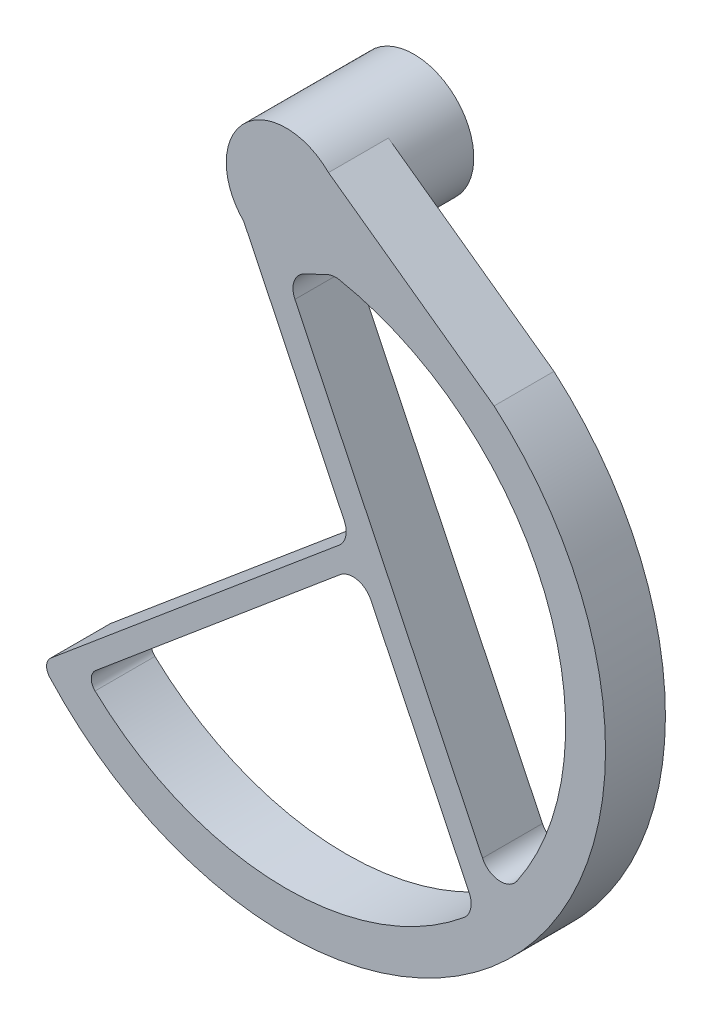
ISO-10303-21;
HEADER;
FILE_DESCRIPTION(('STEP AP214'),'2;1');
FILE_NAME('part.step','',(''),(''),'','','');
FILE_SCHEMA(('AUTOMOTIVE_DESIGN { 1 0 10303 214 1 1 1 1 }'));
ENDSEC;
DATA;
#1=APPLICATION_CONTEXT('core data for automotive mechanical design processes');
#2=APPLICATION_PROTOCOL_DEFINITION('international standard','automotive_design',2000,#1);
#3=PRODUCT_CONTEXT('',#1,'mechanical');
#4=PRODUCT('Part','Part','',(#3));
#5=PRODUCT_RELATED_PRODUCT_CATEGORY('part','',(#4));
#6=PRODUCT_DEFINITION_FORMATION('','',#4);
#7=PRODUCT_DEFINITION_CONTEXT('part definition',#1,'design');
#8=PRODUCT_DEFINITION('design','',#6,#7);
#9=PRODUCT_DEFINITION_SHAPE('','',#8);
#10=(LENGTH_UNIT() NAMED_UNIT(*) SI_UNIT(.MILLI.,.METRE.));
#11=(NAMED_UNIT(*) PLANE_ANGLE_UNIT() SI_UNIT($,.RADIAN.));
#12=(NAMED_UNIT(*) SI_UNIT($,.STERADIAN.) SOLID_ANGLE_UNIT());
#13=UNCERTAINTY_MEASURE_WITH_UNIT(LENGTH_MEASURE(1.E-05),#10,'distance_accuracy_value','');
#14=(GEOMETRIC_REPRESENTATION_CONTEXT(3) GLOBAL_UNCERTAINTY_ASSIGNED_CONTEXT((#13)) GLOBAL_UNIT_ASSIGNED_CONTEXT((#10,
#11,#12)) REPRESENTATION_CONTEXT('',''));
#15=CARTESIAN_POINT('',(0.,0.,0.));
#16=DIRECTION('',(0.,0.,1.));
#17=DIRECTION('',(1.,0.,0.));
#18=AXIS2_PLACEMENT_3D('',#15,#16,#17);
#19=CARTESIAN_POINT('',(0.,0.,0.));
#20=DIRECTION('',(0.,0.,1.));
#21=DIRECTION('',(1.,0.,0.));
#22=AXIS2_PLACEMENT_3D('',#19,#20,#21);
#23=PLANE('',#22);
#24=DIRECTION('',(0.433389731511241,-0.901206602628173,0.));
#25=VECTOR('',#24,1.);
#26=CARTESIAN_POINT('',(-12.7570586950624,-6.1348621133076,0.));
#27=LINE('',#26,#25);
#28=CARTESIAN_POINT('',(21.2324006956412,-76.8137984043253,0.));
#29=VERTEX_POINT('',#28);
#30=CARTESIAN_POINT('',(45.844843506453,-127.9938203457,0.));
#31=VERTEX_POINT('',#30);
#32=EDGE_CURVE('E206',#29,#31,#27,.T.);
#33=ORIENTED_EDGE('',*,*,#32,.F.);
#34=CARTESIAN_POINT('',(16.7263676825004,-78.9807470618814,0.));
#35=DIRECTION('',(0.,0.,1.));
#36=DIRECTION('',(1.,0.,0.));
#37=AXIS2_PLACEMENT_3D('',#34,#35,#36);
#38=CIRCLE('',#37,5.);
#39=CARTESIAN_POINT('',(13.5112294647628,-75.1515322284145,0.));
#40=VERTEX_POINT('',#39);
#41=EDGE_CURVE('E278',#40,#29,#38,.F.);
#42=ORIENTED_EDGE('',*,*,#41,.F.);
#43=DIRECTION('',(0.765842966693394,0.643027643547508,0.));
#44=VECTOR('',#43,1.);
#45=CARTESIAN_POINT('',(42.5956727933285,-50.7312504333006,0.));
#46=LINE('',#45,#44);
#47=CARTESIAN_POINT('',(-47.7476784165524,-126.586582094174,0.));
#48=VERTEX_POINT('',#47);
#49=EDGE_CURVE('E322',#48,#40,#46,.T.);
#50=ORIENTED_EDGE('',*,*,#49,.F.);
#51=CARTESIAN_POINT('',(-45.8185954859101,-128.884110994254,0.));
#52=DIRECTION('',(0.,0.,1.));
#53=DIRECTION('',(1.,0.,0.));
#54=AXIS2_PLACEMENT_3D('',#51,#52,#53);
#55=CIRCLE('',#54,2.99999999999979);
#56=CARTESIAN_POINT('',(-47.870174388264,-131.072951785042,0.));
#57=VERTEX_POINT('',#56);
#58=EDGE_CURVE('E320',#57,#48,#55,.F.);
#59=ORIENTED_EDGE('',*,*,#58,.F.);
#60=CARTESIAN_POINT('',(0.,-80.,0.));
#61=DIRECTION('',(0.,0.,1.));
#62=DIRECTION('',(1.,0.,0.));
#63=AXIS2_PLACEMENT_3D('',#60,#61,#62);
#64=CIRCLE('',#63,70.);
#65=CARTESIAN_POINT('',(44.5187189927976,-134.019289695814,0.));
#66=VERTEX_POINT('',#65);
#67=EDGE_CURVE('E317',#57,#66,#64,.T.);
#68=ORIENTED_EDGE('',*,*,#67,.T.);
#69=CARTESIAN_POINT('',(41.3388104933121,-130.160769003256,0.));
#70=DIRECTION('',(0.,0.,1.));
#71=DIRECTION('',(1.,0.,0.));
#72=AXIS2_PLACEMENT_3D('',#69,#70,#71);
#73=CIRCLE('',#72,4.99999999999999);
#74=EDGE_CURVE('E314',#31,#66,#73,.F.);
#75=ORIENTED_EDGE('',*,*,#74,.F.);
#76=EDGE_LOOP('',(#33,#42,#50,#59,#68,#75));
#77=FACE_BOUND('',#76,.T.);
#78=CARTESIAN_POINT('',(0.,0.,0.));
#79=DIRECTION('',(0.,0.,-1.));
#80=DIRECTION('',(-1.,0.,0.));
#81=AXIS2_PLACEMENT_3D('',#78,#79,#80);
#82=CIRCLE('',#81,15.);
#83=CARTESIAN_POINT('',(10.6066017177981,10.6066017177983,0.));
#84=VERTEX_POINT('',#83);
#85=CARTESIAN_POINT('',(7.47266922099557,-13.0061222012399,0.));
#86=VERTEX_POINT('',#85);
#87=EDGE_CURVE('E174',#84,#86,#82,.T.);
#88=ORIENTED_EDGE('',*,*,#87,.F.);
#89=DIRECTION('',(0.811357931424902,-0.584549661802916,0.));
#90=VECTOR('',#89,1.);
#91=CARTESIAN_POINT('',(8.65474635415258,12.0128323695446,0.));
#92=LINE('',#91,#90);
#93=CARTESIAN_POINT('',(52.0761789176773,-19.2705047828153,0.));
#94=VERTEX_POINT('',#93);
#95=EDGE_CURVE('E178',#84,#94,#92,.T.);
#96=ORIENTED_EDGE('',*,*,#95,.T.);
#97=CARTESIAN_POINT('',(0.,-80.,0.));
#98=DIRECTION('',(0.,0.,1.));
#99=DIRECTION('',(1.,0.,0.));
#100=AXIS2_PLACEMENT_3D('',#97,#98,#99);
#101=CIRCLE('',#100,80.);
#102=CARTESIAN_POINT('',(-59.2335308651964,-133.771635843089,0.));
#103=VERTEX_POINT('',#102);
#104=EDGE_CURVE('E204',#103,#94,#101,.T.);
#105=ORIENTED_EDGE('',*,*,#104,.F.);
#106=CARTESIAN_POINT('',(-57.0122734577518,-131.755199498973,0.));
#107=DIRECTION('',(0.,0.,1.));
#108=DIRECTION('',(1.,0.,0.));
#109=AXIS2_PLACEMENT_3D('',#106,#107,#108);
#110=CIRCLE('',#109,2.99999999999976);
#111=CARTESIAN_POINT('',(-58.9406362868111,-129.457066169617,0.));
#112=VERTEX_POINT('',#111);
#113=EDGE_CURVE('E208',#103,#112,#110,.F.);
#114=ORIENTED_EDGE('',*,*,#113,.T.);
#115=DIRECTION('',(0.766044443118982,0.642787609686534,0.));
#116=VECTOR('',#115,1.);
#117=CARTESIAN_POINT('',(39.3923101204882,-46.9459271066778,0.));
#118=LINE('',#117,#116);
#119=CARTESIAN_POINT('',(13.2441851892925,-68.8868090924212,0.));
#120=VERTEX_POINT('',#119);
#121=EDGE_CURVE('E307',#112,#120,#118,.T.);
#122=ORIENTED_EDGE('',*,*,#121,.T.);
#123=CARTESIAN_POINT('',(10.0302471408598,-65.0565868768263,0.));
#124=DIRECTION('',(0.,0.,1.));
#125=DIRECTION('',(1.,0.,0.));
#126=AXIS2_PLACEMENT_3D('',#123,#124,#125);
#127=CIRCLE('',#126,5.);
#128=CARTESIAN_POINT('',(14.5362801540007,-62.8896382192701,0.));
#129=VERTEX_POINT('',#128);
#130=EDGE_CURVE('E264',#120,#129,#127,.T.);
#131=ORIENTED_EDGE('',*,*,#130,.T.);
#132=DIRECTION('',(0.433389731511242,-0.901206602628173,0.));
#133=VECTOR('',#132,1.);
#134=CARTESIAN_POINT('',(-12.7570586950624,-6.13486211330761,0.));
#135=LINE('',#134,#133);
#136=CARTESIAN_POINT('',(-10.6066017177981,-10.6066017177983,0.));
#137=VERTEX_POINT('',#136);
#138=EDGE_CURVE('E203',#137,#129,#135,.T.);
#139=ORIENTED_EDGE('',*,*,#138,.F.);
#140=CARTESIAN_POINT('',(5.49416198956526,-13.9575851791209,0.));
#141=VERTEX_POINT('',#140);
#142=EDGE_CURVE('E11',#141,#137,#82,.T.);
#143=ORIENTED_EDGE('',*,*,#142,.F.);
#144=DIRECTION('',(-0.90120660262817,-0.433389731511248,0.));
#145=VECTOR('',#144,1.);
#146=CARTESIAN_POINT('',(6.4834156052804,-13.4818536901804,0.));
#147=LINE('',#146,#145);
#148=CARTESIAN_POINT('',(4.54083614175573,-14.4160390253533,0.));
#149=VERTEX_POINT('',#148);
#150=EDGE_CURVE('E243',#141,#149,#147,.T.);
#151=ORIENTED_EDGE('',*,*,#150,.T.);
#152=CARTESIAN_POINT('',(6.70778479931193,-18.9220720384942,0.));
#153=DIRECTION('',(0.,0.,1.));
#154=DIRECTION('',(-1.,0.,0.));
#155=AXIS2_PLACEMENT_3D('',#152,#153,#154);
#156=CIRCLE('',#155,5.);
#157=CARTESIAN_POINT('',(2.20175178617109,-21.0890206960504,0.));
#158=VERTEX_POINT('',#157);
#159=EDGE_CURVE('E230',#149,#158,#156,.T.);
#160=ORIENTED_EDGE('',*,*,#159,.T.);
#161=DIRECTION('',(0.433389731511244,-0.901206602628172,0.));
#162=VECTOR('',#161,1.);
#163=CARTESIAN_POINT('',(49.1895897966885,-118.797265214536,0.));
#164=LINE('',#163,#162);
#165=CARTESIAN_POINT('',(49.1895897966885,-118.797265214536,0.));
#166=VERTEX_POINT('',#165);
#167=EDGE_CURVE('E233',#158,#166,#164,.T.);
#168=ORIENTED_EDGE('',*,*,#167,.T.);
#169=CARTESIAN_POINT('',(53.6956228098294,-116.63031655698,0.));
#170=DIRECTION('',(0.,0.,1.));
#171=DIRECTION('',(-1.,0.,0.));
#172=AXIS2_PLACEMENT_3D('',#169,#170,#171);
#173=CIRCLE('',#172,5.);
#174=CARTESIAN_POINT('',(57.8260553336624,-119.448033215209,0.));
#175=VERTEX_POINT('',#174);
#176=EDGE_CURVE('E60',#166,#175,#173,.T.);
#177=ORIENTED_EDGE('',*,*,#176,.T.);
#178=CARTESIAN_POINT('',(0.,-80.,0.));
#179=DIRECTION('',(0.,0.,1.));
#180=DIRECTION('',(1.,0.,0.));
#181=AXIS2_PLACEMENT_3D('',#178,#179,#180);
#182=CIRCLE('',#181,69.9999999999999);
#183=CARTESIAN_POINT('',(13.3394234662008,-11.2827548457495,0.));
#184=VERTEX_POINT('',#183);
#185=EDGE_CURVE('E238',#175,#184,#182,.T.);
#186=ORIENTED_EDGE('',*,*,#185,.T.);
#187=CARTESIAN_POINT('',(12.3866075043293,-16.1911294996245,0.));
#188=DIRECTION('',(0.,0.,1.));
#189=DIRECTION('',(1.,0.,0.));
#190=AXIS2_PLACEMENT_3D('',#187,#188,#189);
#191=CIRCLE('',#190,5.);
#192=CARTESIAN_POINT('',(10.2196588467731,-11.6850964864837,0.));
#193=VERTEX_POINT('',#192);
#194=EDGE_CURVE('E241',#184,#193,#191,.T.);
#195=ORIENTED_EDGE('',*,*,#194,.T.);
#196=EDGE_CURVE('E181',#193,#86,#147,.T.);
#197=ORIENTED_EDGE('',*,*,#196,.T.);
#198=EDGE_LOOP('',(#88,#96,#105,#114,#122,#131,#139,#143,#151,#160,#168,#177,#186,#195,#197));
#199=FACE_BOUND('',#198,.T.);
#200=ADVANCED_FACE('F35',(#77,#199),#23,.F.);
#201=CARTESIAN_POINT('',(-12.7570586950624,-6.1348621133076,15.));
#202=DIRECTION('',(0.901206602628173,0.433389731511241,0.));
#203=DIRECTION('',(-0.433389731511241,0.901206602628173,0.));
#204=AXIS2_PLACEMENT_3D('',#201,#202,#203);
#205=PLANE('',#204);
#206=ORIENTED_EDGE('',*,*,#32,.T.);
#207=DIRECTION('',(0.,0.,-1.));
#208=VECTOR('',#207,1.);
#209=CARTESIAN_POINT('',(45.844843506453,-127.9938203457,15.));
#210=LINE('',#209,#208);
#211=CARTESIAN_POINT('',(45.844843506453,-127.9938203457,15.));
#212=VERTEX_POINT('',#211);
#213=EDGE_CURVE('E44',#212,#31,#210,.T.);
#214=ORIENTED_EDGE('',*,*,#213,.F.);
#215=DIRECTION('',(0.433389731511241,-0.901206602628173,0.));
#216=VECTOR('',#215,1.);
#217=CARTESIAN_POINT('',(-12.7570586950624,-6.1348621133076,15.));
#218=LINE('',#217,#216);
#219=CARTESIAN_POINT('',(21.2324006956412,-76.8137984043253,15.));
#220=VERTEX_POINT('',#219);
#221=EDGE_CURVE('E291',#220,#212,#218,.T.);
#222=ORIENTED_EDGE('',*,*,#221,.F.);
#223=DIRECTION('',(0.,0.,-1.));
#224=VECTOR('',#223,1.);
#225=CARTESIAN_POINT('',(21.2324006956412,-76.8137984043253,15.));
#226=LINE('',#225,#224);
#227=EDGE_CURVE('E325',#220,#29,#226,.T.);
#228=ORIENTED_EDGE('',*,*,#227,.T.);
#229=EDGE_LOOP('',(#206,#214,#222,#228));
#230=FACE_BOUND('',#229,.T.);
#231=ADVANCED_FACE('F390',(#230),#205,.F.);
#232=CARTESIAN_POINT('',(41.3388104933121,-130.160769003256,15.));
#233=DIRECTION('',(0.,0.,-1.));
#234=DIRECTION('',(-1.,0.,0.));
#235=AXIS2_PLACEMENT_3D('',#232,#233,#234);
#236=CYLINDRICAL_SURFACE('',#235,4.99999999999999);
#237=ORIENTED_EDGE('',*,*,#74,.T.);
#238=DIRECTION('',(0.,0.,-1.));
#239=VECTOR('',#238,1.);
#240=CARTESIAN_POINT('',(44.5187189927976,-134.019289695814,15.));
#241=LINE('',#240,#239);
#242=CARTESIAN_POINT('',(44.5187189927976,-134.019289695814,15.));
#243=VERTEX_POINT('',#242);
#244=EDGE_CURVE('E336',#243,#66,#241,.T.);
#245=ORIENTED_EDGE('',*,*,#244,.F.);
#246=CARTESIAN_POINT('',(41.3388104933121,-130.160769003256,15.));
#247=DIRECTION('',(0.,0.,1.));
#248=DIRECTION('',(1.,0.,0.));
#249=AXIS2_PLACEMENT_3D('',#246,#247,#248);
#250=CIRCLE('',#249,4.99999999999999);
#251=EDGE_CURVE('E294',#212,#243,#250,.F.);
#252=ORIENTED_EDGE('',*,*,#251,.F.);
#253=ORIENTED_EDGE('',*,*,#213,.T.);
#254=EDGE_LOOP('',(#237,#245,#252,#253));
#255=FACE_BOUND('',#254,.T.);
#256=ADVANCED_FACE('F396',(#255),#236,.F.);
#257=CARTESIAN_POINT('',(0.,-80.,15.));
#258=DIRECTION('',(0.,0.,-1.));
#259=DIRECTION('',(-1.,0.,0.));
#260=AXIS2_PLACEMENT_3D('',#257,#258,#259);
#261=CYLINDRICAL_SURFACE('',#260,70.);
#262=ORIENTED_EDGE('',*,*,#67,.F.);
#263=DIRECTION('',(0.,0.,-1.));
#264=VECTOR('',#263,1.);
#265=CARTESIAN_POINT('',(-47.870174388264,-131.072951785042,15.));
#266=LINE('',#265,#264);
#267=CARTESIAN_POINT('',(-47.870174388264,-131.072951785042,15.));
#268=VERTEX_POINT('',#267);
#269=EDGE_CURVE('E334',#268,#57,#266,.T.);
#270=ORIENTED_EDGE('',*,*,#269,.F.);
#271=CARTESIAN_POINT('',(0.,-80.,15.));
#272=DIRECTION('',(0.,0.,1.));
#273=DIRECTION('',(1.,0.,0.));
#274=AXIS2_PLACEMENT_3D('',#271,#272,#273);
#275=CIRCLE('',#274,70.);
#276=EDGE_CURVE('E296',#268,#243,#275,.T.);
#277=ORIENTED_EDGE('',*,*,#276,.T.);
#278=ORIENTED_EDGE('',*,*,#244,.T.);
#279=EDGE_LOOP('',(#262,#270,#277,#278));
#280=FACE_BOUND('',#279,.T.);
#281=ADVANCED_FACE('F414',(#280),#261,.F.);
#282=CARTESIAN_POINT('',(-45.8185954859101,-128.884110994254,15.));
#283=DIRECTION('',(0.,0.,-1.));
#284=DIRECTION('',(-1.,0.,0.));
#285=AXIS2_PLACEMENT_3D('',#282,#283,#284);
#286=CYLINDRICAL_SURFACE('',#285,2.99999999999979);
#287=ORIENTED_EDGE('',*,*,#58,.T.);
#288=DIRECTION('',(0.,0.,-1.));
#289=VECTOR('',#288,1.);
#290=CARTESIAN_POINT('',(-47.7476784165524,-126.586582094174,15.));
#291=LINE('',#290,#289);
#292=CARTESIAN_POINT('',(-47.7476784165524,-126.586582094174,15.));
#293=VERTEX_POINT('',#292);
#294=EDGE_CURVE('E331',#293,#48,#291,.T.);
#295=ORIENTED_EDGE('',*,*,#294,.F.);
#296=CARTESIAN_POINT('',(-45.8185954859101,-128.884110994254,15.));
#297=DIRECTION('',(0.,0.,1.));
#298=DIRECTION('',(1.,0.,0.));
#299=AXIS2_PLACEMENT_3D('',#296,#297,#298);
#300=CIRCLE('',#299,2.99999999999979);
#301=EDGE_CURVE('E299',#268,#293,#300,.F.);
#302=ORIENTED_EDGE('',*,*,#301,.F.);
#303=ORIENTED_EDGE('',*,*,#269,.T.);
#304=EDGE_LOOP('',(#287,#295,#302,#303));
#305=FACE_BOUND('',#304,.T.);
#306=ADVANCED_FACE('F410',(#305),#286,.F.);
#307=CARTESIAN_POINT('',(42.5956727933285,-50.7312504333006,15.));
#308=DIRECTION('',(-0.643027643547508,0.765842966693394,0.));
#309=DIRECTION('',(-0.765842966693394,-0.643027643547508,0.));
#310=AXIS2_PLACEMENT_3D('',#307,#308,#309);
#311=PLANE('',#310);
#312=ORIENTED_EDGE('',*,*,#49,.T.);
#313=DIRECTION('',(0.,0.,-1.));
#314=VECTOR('',#313,1.);
#315=CARTESIAN_POINT('',(13.5112294647628,-75.1515322284145,15.));
#316=LINE('',#315,#314);
#317=CARTESIAN_POINT('',(13.5112294647628,-75.1515322284145,15.));
#318=VERTEX_POINT('',#317);
#319=EDGE_CURVE('E328',#318,#40,#316,.T.);
#320=ORIENTED_EDGE('',*,*,#319,.F.);
#321=DIRECTION('',(0.765842966693394,0.643027643547508,0.));
#322=VECTOR('',#321,1.);
#323=CARTESIAN_POINT('',(42.5956727933285,-50.7312504333006,15.));
#324=LINE('',#323,#322);
#325=EDGE_CURVE('E301',#293,#318,#324,.T.);
#326=ORIENTED_EDGE('',*,*,#325,.F.);
#327=ORIENTED_EDGE('',*,*,#294,.T.);
#328=EDGE_LOOP('',(#312,#320,#326,#327));
#329=FACE_BOUND('',#328,.T.);
#330=ADVANCED_FACE('F407',(#329),#311,.F.);
#331=CARTESIAN_POINT('',(10.0302471408598,-65.0565868768263,15.));
#332=DIRECTION('',(0.,0.,-1.));
#333=DIRECTION('',(-1.,0.,0.));
#334=AXIS2_PLACEMENT_3D('',#331,#332,#333);
#335=CYLINDRICAL_SURFACE('',#334,5.);
#336=ORIENTED_EDGE('',*,*,#130,.F.);
#337=DIRECTION('',(0.,0.,-1.));
#338=VECTOR('',#337,1.);
#339=CARTESIAN_POINT('',(13.2441851892925,-68.8868090924212,15.));
#340=LINE('',#339,#338);
#341=CARTESIAN_POINT('',(13.2441851892925,-68.8868090924212,15.));
#342=VERTEX_POINT('',#341);
#343=EDGE_CURVE('E222',#342,#120,#340,.T.);
#344=ORIENTED_EDGE('',*,*,#343,.F.);
#345=CARTESIAN_POINT('',(10.0302471408598,-65.0565868768263,15.));
#346=DIRECTION('',(0.,0.,1.));
#347=DIRECTION('',(1.,0.,0.));
#348=AXIS2_PLACEMENT_3D('',#345,#346,#347);
#349=CIRCLE('',#348,5.);
#350=CARTESIAN_POINT('',(14.5362801540007,-62.8896382192701,15.));
#351=VERTEX_POINT('',#350);
#352=EDGE_CURVE('E274',#342,#351,#349,.T.);
#353=ORIENTED_EDGE('',*,*,#352,.T.);
#354=DIRECTION('',(0.,0.,-1.));
#355=VECTOR('',#354,1.);
#356=CARTESIAN_POINT('',(14.5362801540007,-62.8896382192701,15.));
#357=LINE('',#356,#355);
#358=EDGE_CURVE('E218',#351,#129,#357,.T.);
#359=ORIENTED_EDGE('',*,*,#358,.T.);
#360=EDGE_LOOP('',(#336,#344,#353,#359));
#361=FACE_BOUND('',#360,.T.);
#362=ADVANCED_FACE('F37',(#361),#335,.F.);
#363=CARTESIAN_POINT('',(39.3923101204882,-46.9459271066778,15.));
#364=DIRECTION('',(-0.642787609686534,0.766044443118983,0.));
#365=DIRECTION('',(-0.766044443118982,-0.642787609686534,0.));
#366=AXIS2_PLACEMENT_3D('',#363,#364,#365);
#367=PLANE('',#366);
#368=ORIENTED_EDGE('',*,*,#121,.F.);
#369=DIRECTION('',(0.,0.,-1.));
#370=VECTOR('',#369,1.);
#371=CARTESIAN_POINT('',(-58.9406362868111,-129.457066169617,15.));
#372=LINE('',#371,#370);
#373=CARTESIAN_POINT('',(-58.9406362868111,-129.457066169617,15.));
#374=VERTEX_POINT('',#373);
#375=EDGE_CURVE('E343',#374,#112,#372,.T.);
#376=ORIENTED_EDGE('',*,*,#375,.F.);
#377=DIRECTION('',(0.766044443118982,0.642787609686534,0.));
#378=VECTOR('',#377,1.);
#379=CARTESIAN_POINT('',(39.3923101204882,-46.9459271066778,15.));
#380=LINE('',#379,#378);
#381=EDGE_CURVE('E277',#374,#342,#380,.T.);
#382=ORIENTED_EDGE('',*,*,#381,.T.);
#383=ORIENTED_EDGE('',*,*,#343,.T.);
#384=EDGE_LOOP('',(#368,#376,#382,#383));
#385=FACE_BOUND('',#384,.T.);
#386=ADVANCED_FACE('F349',(#385),#367,.T.);
#387=CARTESIAN_POINT('',(-57.0122734577518,-131.755199498973,15.));
#388=DIRECTION('',(0.,0.,-1.));
#389=DIRECTION('',(-1.,0.,0.));
#390=AXIS2_PLACEMENT_3D('',#387,#388,#389);
#391=CYLINDRICAL_SURFACE('',#390,2.99999999999976);
#392=ORIENTED_EDGE('',*,*,#113,.F.);
#393=DIRECTION('',(0.,0.,-1.));
#394=VECTOR('',#393,1.);
#395=CARTESIAN_POINT('',(-59.2335308651964,-133.771635843089,15.));
#396=LINE('',#395,#394);
#397=CARTESIAN_POINT('',(-59.2335308651964,-133.771635843089,15.));
#398=VERTEX_POINT('',#397);
#399=EDGE_CURVE('E342',#398,#103,#396,.T.);
#400=ORIENTED_EDGE('',*,*,#399,.F.);
#401=CARTESIAN_POINT('',(-57.0122734577518,-131.755199498973,15.));
#402=DIRECTION('',(0.,0.,1.));
#403=DIRECTION('',(1.,0.,0.));
#404=AXIS2_PLACEMENT_3D('',#401,#402,#403);
#405=CIRCLE('',#404,2.99999999999976);
#406=EDGE_CURVE('E281',#398,#374,#405,.F.);
#407=ORIENTED_EDGE('',*,*,#406,.T.);
#408=ORIENTED_EDGE('',*,*,#375,.T.);
#409=EDGE_LOOP('',(#392,#400,#407,#408));
#410=FACE_BOUND('',#409,.T.);
#411=ADVANCED_FACE('F355',(#410),#391,.T.);
#412=CARTESIAN_POINT('',(0.,-80.,15.));
#413=DIRECTION('',(0.,0.,-1.));
#414=DIRECTION('',(-1.,0.,0.));
#415=AXIS2_PLACEMENT_3D('',#412,#413,#414);
#416=CYLINDRICAL_SURFACE('',#415,80.);
#417=ORIENTED_EDGE('',*,*,#104,.T.);
#418=DIRECTION('',(0.,0.,-1.));
#419=VECTOR('',#418,1.);
#420=CARTESIAN_POINT('',(52.0761789176773,-19.2705047828153,15.));
#421=LINE('',#420,#419);
#422=CARTESIAN_POINT('',(52.0761789176773,-19.2705047828153,15.));
#423=VERTEX_POINT('',#422);
#424=EDGE_CURVE('E197',#423,#94,#421,.T.);
#425=ORIENTED_EDGE('',*,*,#424,.F.);
#426=CARTESIAN_POINT('',(0.,-80.,15.));
#427=DIRECTION('',(0.,0.,1.));
#428=DIRECTION('',(1.,0.,0.));
#429=AXIS2_PLACEMENT_3D('',#426,#427,#428);
#430=CIRCLE('',#429,80.);
#431=EDGE_CURVE('E284',#398,#423,#430,.T.);
#432=ORIENTED_EDGE('',*,*,#431,.F.);
#433=ORIENTED_EDGE('',*,*,#399,.T.);
#434=EDGE_LOOP('',(#417,#425,#432,#433));
#435=FACE_BOUND('',#434,.T.);
#436=ADVANCED_FACE('F359',(#435),#416,.T.);
#437=CARTESIAN_POINT('',(8.65474635415258,12.0128323695446,15.));
#438=DIRECTION('',(0.584549661802916,0.811357931424902,0.));
#439=DIRECTION('',(-0.811357931424902,0.584549661802916,0.));
#440=AXIS2_PLACEMENT_3D('',#437,#438,#439);
#441=PLANE('',#440);
#442=ORIENTED_EDGE('',*,*,#95,.F.);
#443=DIRECTION('',(0.,0.,-1.));
#444=VECTOR('',#443,1.);
#445=CARTESIAN_POINT('',(10.6066017177981,10.6066017177983,15.));
#446=LINE('',#445,#444);
#447=CARTESIAN_POINT('',(10.6066017177981,10.6066017177983,15.));
#448=VERTEX_POINT('',#447);
#449=EDGE_CURVE('E189',#448,#84,#446,.T.);
#450=ORIENTED_EDGE('',*,*,#449,.F.);
#451=DIRECTION('',(0.811357931424902,-0.584549661802916,0.));
#452=VECTOR('',#451,1.);
#453=CARTESIAN_POINT('',(8.65474635415258,12.0128323695446,15.));
#454=LINE('',#453,#452);
#455=EDGE_CURVE('E286',#448,#423,#454,.T.);
#456=ORIENTED_EDGE('',*,*,#455,.T.);
#457=ORIENTED_EDGE('',*,*,#424,.T.);
#458=EDGE_LOOP('',(#442,#450,#456,#457));
#459=FACE_BOUND('',#458,.T.);
#460=ADVANCED_FACE('F200',(#459),#441,.T.);
#461=CARTESIAN_POINT('',(0.,0.,15.));
#462=DIRECTION('',(0.,0.,-1.));
#463=DIRECTION('',(-1.,0.,0.));
#464=AXIS2_PLACEMENT_3D('',#461,#462,#463);
#465=CYLINDRICAL_SURFACE('',#464,15.);
#466=ORIENTED_EDGE('',*,*,#449,.T.);
#467=ORIENTED_EDGE('',*,*,#87,.T.);
#468=EDGE_CURVE('E186',#86,#141,#82,.T.);
#469=ORIENTED_EDGE('',*,*,#468,.T.);
#470=ORIENTED_EDGE('',*,*,#142,.T.);
#471=DIRECTION('',(0.,0.,-1.));
#472=VECTOR('',#471,1.);
#473=CARTESIAN_POINT('',(-10.6066017177981,-10.6066017177983,15.));
#474=LINE('',#473,#472);
#475=CARTESIAN_POINT('',(-10.6066017177981,-10.6066017177983,15.));
#476=VERTEX_POINT('',#475);
#477=EDGE_CURVE('E198',#476,#137,#474,.T.);
#478=ORIENTED_EDGE('',*,*,#477,.F.);
#479=CARTESIAN_POINT('',(0.,0.,15.));
#480=DIRECTION('',(0.,0.,1.));
#481=DIRECTION('',(1.,0.,0.));
#482=AXIS2_PLACEMENT_3D('',#479,#480,#481);
#483=CIRCLE('',#482,15.);
#484=EDGE_CURVE('E193',#448,#476,#483,.T.);
#485=ORIENTED_EDGE('',*,*,#484,.F.);
#486=EDGE_LOOP('',(#466,#467,#469,#470,#478,#485));
#487=FACE_BOUND('',#486,.T.);
#488=CARTESIAN_POINT('',(0.,0.,-17.));
#489=DIRECTION('',(0.,0.,-1.));
#490=DIRECTION('',(-1.,0.,0.));
#491=AXIS2_PLACEMENT_3D('',#488,#489,#490);
#492=CIRCLE('',#491,15.);
#493=CARTESIAN_POINT('',(-15.,0.,-17.));
#494=VERTEX_POINT('',#493);
#495=EDGE_CURVE('E185',#494,#494,#492,.T.);
#496=ORIENTED_EDGE('',*,*,#495,.F.);
#497=EDGE_LOOP('',(#496));
#498=FACE_BOUND('',#497,.T.);
#499=ADVANCED_FACE('F190',(#487,#498),#465,.T.);
#500=CARTESIAN_POINT('',(-12.7570586950624,-6.13486211330761,15.));
#501=DIRECTION('',(0.901206602628173,0.433389731511242,0.));
#502=DIRECTION('',(-0.433389731511242,0.901206602628173,0.));
#503=AXIS2_PLACEMENT_3D('',#500,#501,#502);
#504=PLANE('',#503);
#505=ORIENTED_EDGE('',*,*,#138,.T.);
#506=ORIENTED_EDGE('',*,*,#358,.F.);
#507=DIRECTION('',(0.433389731511242,-0.901206602628173,0.));
#508=VECTOR('',#507,1.);
#509=CARTESIAN_POINT('',(-12.7570586950624,-6.13486211330761,15.));
#510=LINE('',#509,#508);
#511=EDGE_CURVE('E289',#476,#351,#510,.T.);
#512=ORIENTED_EDGE('',*,*,#511,.F.);
#513=ORIENTED_EDGE('',*,*,#477,.T.);
#514=EDGE_LOOP('',(#505,#506,#512,#513));
#515=FACE_BOUND('',#514,.T.);
#516=ADVANCED_FACE('F365',(#515),#504,.F.);
#517=CARTESIAN_POINT('',(16.7263676825004,-78.9807470618814,15.));
#518=DIRECTION('',(0.,0.,-1.));
#519=DIRECTION('',(-1.,0.,0.));
#520=AXIS2_PLACEMENT_3D('',#517,#518,#519);
#521=CYLINDRICAL_SURFACE('',#520,5.);
#522=ORIENTED_EDGE('',*,*,#41,.T.);
#523=ORIENTED_EDGE('',*,*,#227,.F.);
#524=CARTESIAN_POINT('',(16.7263676825004,-78.9807470618814,15.));
#525=DIRECTION('',(0.,0.,1.));
#526=DIRECTION('',(1.,0.,0.));
#527=AXIS2_PLACEMENT_3D('',#524,#525,#526);
#528=CIRCLE('',#527,5.);
#529=EDGE_CURVE('E303',#318,#220,#528,.F.);
#530=ORIENTED_EDGE('',*,*,#529,.F.);
#531=ORIENTED_EDGE('',*,*,#319,.T.);
#532=EDGE_LOOP('',(#522,#523,#530,#531));
#533=FACE_BOUND('',#532,.T.);
#534=ADVANCED_FACE('F403',(#533),#521,.F.);
#535=CARTESIAN_POINT('',(0.,0.,15.));
#536=DIRECTION('',(0.,0.,1.));
#537=DIRECTION('',(1.,0.,0.));
#538=AXIS2_PLACEMENT_3D('',#535,#536,#537);
#539=PLANE('',#538);
#540=CARTESIAN_POINT('',(6.70778479931193,-18.9220720384942,15.));
#541=DIRECTION('',(0.,0.,1.));
#542=DIRECTION('',(-1.,0.,0.));
#543=AXIS2_PLACEMENT_3D('',#540,#541,#542);
#544=CIRCLE('',#543,5.);
#545=CARTESIAN_POINT('',(4.54083614175573,-14.4160390253533,15.));
#546=VERTEX_POINT('',#545);
#547=CARTESIAN_POINT('',(2.20175178617109,-21.0890206960504,15.));
#548=VERTEX_POINT('',#547);
#549=EDGE_CURVE('E52',#546,#548,#544,.T.);
#550=ORIENTED_EDGE('',*,*,#549,.F.);
#551=DIRECTION('',(-0.901206602628171,-0.433389731511247,0.));
#552=VECTOR('',#551,1.);
#553=CARTESIAN_POINT('',(6.4834156052804,-13.4818536901804,15.));
#554=LINE('',#553,#552);
#555=CARTESIAN_POINT('',(10.2196588467731,-11.6850964864837,15.));
#556=VERTEX_POINT('',#555);
#557=EDGE_CURVE('E234',#556,#546,#554,.T.);
#558=ORIENTED_EDGE('',*,*,#557,.F.);
#559=CARTESIAN_POINT('',(12.3866075043293,-16.1911294996245,15.));
#560=DIRECTION('',(0.,0.,1.));
#561=DIRECTION('',(1.,0.,0.));
#562=AXIS2_PLACEMENT_3D('',#559,#560,#561);
#563=CIRCLE('',#562,5.);
#564=CARTESIAN_POINT('',(13.3394234662008,-11.2827548457495,15.));
#565=VERTEX_POINT('',#564);
#566=EDGE_CURVE('E257',#565,#556,#563,.T.);
#567=ORIENTED_EDGE('',*,*,#566,.F.);
#568=CARTESIAN_POINT('',(0.,-80.,15.));
#569=DIRECTION('',(0.,0.,1.));
#570=DIRECTION('',(1.,0.,0.));
#571=AXIS2_PLACEMENT_3D('',#568,#569,#570);
#572=CIRCLE('',#571,69.9999999999999);
#573=CARTESIAN_POINT('',(57.8260553336624,-119.448033215209,15.));
#574=VERTEX_POINT('',#573);
#575=EDGE_CURVE('E254',#574,#565,#572,.T.);
#576=ORIENTED_EDGE('',*,*,#575,.F.);
#577=CARTESIAN_POINT('',(53.6956228098294,-116.63031655698,15.));
#578=DIRECTION('',(0.,0.,1.));
#579=DIRECTION('',(-1.,0.,0.));
#580=AXIS2_PLACEMENT_3D('',#577,#578,#579);
#581=CIRCLE('',#580,5.);
#582=CARTESIAN_POINT('',(49.1895897966885,-118.797265214536,15.));
#583=VERTEX_POINT('',#582);
#584=EDGE_CURVE('E251',#583,#574,#581,.T.);
#585=ORIENTED_EDGE('',*,*,#584,.F.);
#586=DIRECTION('',(0.433389731511244,-0.901206602628172,0.));
#587=VECTOR('',#586,1.);
#588=CARTESIAN_POINT('',(49.1895897966885,-118.797265214536,15.));
#589=LINE('',#588,#587);
#590=EDGE_CURVE('E248',#548,#583,#589,.T.);
#591=ORIENTED_EDGE('',*,*,#590,.F.);
#592=EDGE_LOOP('',(#550,#558,#567,#576,#585,#591));
#593=FACE_BOUND('',#592,.T.);
#594=ORIENTED_EDGE('',*,*,#352,.F.);
#595=ORIENTED_EDGE('',*,*,#381,.F.);
#596=ORIENTED_EDGE('',*,*,#406,.F.);
#597=ORIENTED_EDGE('',*,*,#431,.T.);
#598=ORIENTED_EDGE('',*,*,#455,.F.);
#599=ORIENTED_EDGE('',*,*,#484,.T.);
#600=ORIENTED_EDGE('',*,*,#511,.T.);
#601=EDGE_LOOP('',(#594,#595,#596,#597,#598,#599,#600));
#602=FACE_BOUND('',#601,.T.);
#603=ORIENTED_EDGE('',*,*,#221,.T.);
#604=ORIENTED_EDGE('',*,*,#251,.T.);
#605=ORIENTED_EDGE('',*,*,#276,.F.);
#606=ORIENTED_EDGE('',*,*,#301,.T.);
#607=ORIENTED_EDGE('',*,*,#325,.T.);
#608=ORIENTED_EDGE('',*,*,#529,.T.);
#609=EDGE_LOOP('',(#603,#604,#605,#606,#607,#608));
#610=FACE_BOUND('',#609,.T.);
#611=ADVANCED_FACE('F361',(#593,#602,#610),#539,.T.);
#612=CARTESIAN_POINT('',(6.70778479931193,-18.9220720384942,0.));
#613=DIRECTION('',(0.,0.,1.));
#614=DIRECTION('',(1.,0.,0.));
#615=AXIS2_PLACEMENT_3D('',#612,#613,#614);
#616=CYLINDRICAL_SURFACE('',#615,5.);
#617=ORIENTED_EDGE('',*,*,#549,.T.);
#618=DIRECTION('',(0.,0.,1.));
#619=VECTOR('',#618,1.);
#620=CARTESIAN_POINT('',(2.20175178617109,-21.0890206960504,0.));
#621=LINE('',#620,#619);
#622=EDGE_CURVE('E245',#158,#548,#621,.T.);
#623=ORIENTED_EDGE('',*,*,#622,.F.);
#624=ORIENTED_EDGE('',*,*,#159,.F.);
#625=DIRECTION('',(0.,0.,1.));
#626=VECTOR('',#625,1.);
#627=CARTESIAN_POINT('',(4.54083614175573,-14.4160390253533,0.));
#628=LINE('',#627,#626);
#629=EDGE_CURVE('E262',#149,#546,#628,.T.);
#630=ORIENTED_EDGE('',*,*,#629,.T.);
#631=EDGE_LOOP('',(#617,#623,#624,#630));
#632=FACE_BOUND('',#631,.T.);
#633=ADVANCED_FACE('F519',(#632),#616,.F.);
#634=CARTESIAN_POINT('',(6.4834156052804,-13.4818536901804,0.));
#635=DIRECTION('',(-0.433389731511247,0.901206602628171,0.));
#636=DIRECTION('',(-0.901206602628171,-0.433389731511247,0.));
#637=AXIS2_PLACEMENT_3D('',#634,#635,#636);
#638=PLANE('',#637);
#639=ORIENTED_EDGE('',*,*,#557,.T.);
#640=ORIENTED_EDGE('',*,*,#629,.F.);
#641=ORIENTED_EDGE('',*,*,#150,.F.);
#642=EDGE_CURVE('E246',#86,#141,#147,.T.);
#643=ORIENTED_EDGE('',*,*,#642,.F.);
#644=ORIENTED_EDGE('',*,*,#196,.F.);
#645=DIRECTION('',(0.,0.,1.));
#646=VECTOR('',#645,1.);
#647=CARTESIAN_POINT('',(10.2196588467731,-11.6850964864837,0.));
#648=LINE('',#647,#646);
#649=EDGE_CURVE('E265',#193,#556,#648,.T.);
#650=ORIENTED_EDGE('',*,*,#649,.T.);
#651=EDGE_LOOP('',(#639,#640,#641,#643,#644,#650));
#652=FACE_BOUND('',#651,.T.);
#653=ADVANCED_FACE('F370',(#652),#638,.F.);
#654=CARTESIAN_POINT('',(12.3866075043293,-16.1911294996245,0.));
#655=DIRECTION('',(0.,0.,1.));
#656=DIRECTION('',(1.,0.,0.));
#657=AXIS2_PLACEMENT_3D('',#654,#655,#656);
#658=CYLINDRICAL_SURFACE('',#657,5.);
#659=ORIENTED_EDGE('',*,*,#566,.T.);
#660=ORIENTED_EDGE('',*,*,#649,.F.);
#661=ORIENTED_EDGE('',*,*,#194,.F.);
#662=DIRECTION('',(0.,0.,1.));
#663=VECTOR('',#662,1.);
#664=CARTESIAN_POINT('',(13.3394234662008,-11.2827548457495,0.));
#665=LINE('',#664,#663);
#666=EDGE_CURVE('E267',#184,#565,#665,.T.);
#667=ORIENTED_EDGE('',*,*,#666,.T.);
#668=EDGE_LOOP('',(#659,#660,#661,#667));
#669=FACE_BOUND('',#668,.T.);
#670=ADVANCED_FACE('F533',(#669),#658,.F.);
#671=CARTESIAN_POINT('',(0.,-80.,0.));
#672=DIRECTION('',(0.,0.,1.));
#673=DIRECTION('',(1.,0.,0.));
#674=AXIS2_PLACEMENT_3D('',#671,#672,#673);
#675=CYLINDRICAL_SURFACE('',#674,69.9999999999999);
#676=ORIENTED_EDGE('',*,*,#575,.T.);
#677=ORIENTED_EDGE('',*,*,#666,.F.);
#678=ORIENTED_EDGE('',*,*,#185,.F.);
#679=DIRECTION('',(0.,0.,1.));
#680=VECTOR('',#679,1.);
#681=CARTESIAN_POINT('',(57.8260553336624,-119.448033215209,0.));
#682=LINE('',#681,#680);
#683=EDGE_CURVE('E269',#175,#574,#682,.T.);
#684=ORIENTED_EDGE('',*,*,#683,.T.);
#685=EDGE_LOOP('',(#676,#677,#678,#684));
#686=FACE_BOUND('',#685,.T.);
#687=ADVANCED_FACE('F542',(#686),#675,.F.);
#688=CARTESIAN_POINT('',(53.6956228098294,-116.63031655698,0.));
#689=DIRECTION('',(0.,0.,1.));
#690=DIRECTION('',(1.,0.,0.));
#691=AXIS2_PLACEMENT_3D('',#688,#689,#690);
#692=CYLINDRICAL_SURFACE('',#691,5.);
#693=ORIENTED_EDGE('',*,*,#584,.T.);
#694=ORIENTED_EDGE('',*,*,#683,.F.);
#695=ORIENTED_EDGE('',*,*,#176,.F.);
#696=DIRECTION('',(0.,0.,1.));
#697=VECTOR('',#696,1.);
#698=CARTESIAN_POINT('',(49.1895897966885,-118.797265214536,0.));
#699=LINE('',#698,#697);
#700=EDGE_CURVE('E271',#166,#583,#699,.T.);
#701=ORIENTED_EDGE('',*,*,#700,.T.);
#702=EDGE_LOOP('',(#693,#694,#695,#701));
#703=FACE_BOUND('',#702,.T.);
#704=ADVANCED_FACE('F385',(#703),#692,.F.);
#705=CARTESIAN_POINT('',(49.1895897966885,-118.797265214536,0.));
#706=DIRECTION('',(-0.901206602628172,-0.433389731511244,0.));
#707=DIRECTION('',(0.433389731511244,-0.901206602628172,0.));
#708=AXIS2_PLACEMENT_3D('',#705,#706,#707);
#709=PLANE('',#708);
#710=ORIENTED_EDGE('',*,*,#590,.T.);
#711=ORIENTED_EDGE('',*,*,#700,.F.);
#712=ORIENTED_EDGE('',*,*,#167,.F.);
#713=ORIENTED_EDGE('',*,*,#622,.T.);
#714=EDGE_LOOP('',(#710,#711,#712,#713));
#715=FACE_BOUND('',#714,.T.);
#716=ADVANCED_FACE('F376',(#715),#709,.F.);
#717=CARTESIAN_POINT('',(0.,0.,0.));
#718=DIRECTION('',(0.,0.,-1.));
#719=DIRECTION('',(-1.,0.,0.));
#720=AXIS2_PLACEMENT_3D('',#717,#718,#719);
#721=PLANE('',#720);
#722=ORIENTED_EDGE('',*,*,#468,.F.);
#723=ORIENTED_EDGE('',*,*,#642,.T.);
#724=EDGE_LOOP('',(#722,#723));
#725=FACE_BOUND('',#724,.T.);
#726=ADVANCED_FACE('F373',(#725),#721,.F.);
#727=CARTESIAN_POINT('',(0.,0.,-17.));
#728=DIRECTION('',(0.,0.,-1.));
#729=DIRECTION('',(-1.,0.,0.));
#730=AXIS2_PLACEMENT_3D('',#727,#728,#729);
#731=PLANE('',#730);
#732=CARTESIAN_POINT('',(0.,0.,-17.));
#733=DIRECTION('',(0.,0.,-1.));
#734=DIRECTION('',(-1.,0.,0.));
#735=AXIS2_PLACEMENT_3D('',#732,#733,#734);
#736=CIRCLE('',#735,10.);
#737=CARTESIAN_POINT('',(-10.,0.,-17.));
#738=VERTEX_POINT('',#737);
#739=EDGE_CURVE('E620',#738,#738,#736,.T.);
#740=ORIENTED_EDGE('',*,*,#739,.F.);
#741=EDGE_LOOP('',(#740));
#742=FACE_BOUND('',#741,.T.);
#743=ORIENTED_EDGE('',*,*,#495,.T.);
#744=EDGE_LOOP('',(#743));
#745=FACE_BOUND('',#744,.T.);
#746=ADVANCED_FACE('F375',(#742,#745),#731,.T.);
#747=CARTESIAN_POINT('',(0.,0.,-15.));
#748=DIRECTION('',(0.,0.,-1.));
#749=DIRECTION('',(-1.,0.,0.));
#750=AXIS2_PLACEMENT_3D('',#747,#748,#749);
#751=CYLINDRICAL_SURFACE('',#750,10.);
#752=CARTESIAN_POINT('',(0.,0.,-15.));
#753=DIRECTION('',(0.,0.,-1.));
#754=DIRECTION('',(-1.,0.,0.));
#755=AXIS2_PLACEMENT_3D('',#752,#753,#754);
#756=CIRCLE('',#755,10.);
#757=CARTESIAN_POINT('',(-10.,0.,-15.));
#758=VERTEX_POINT('',#757);
#759=EDGE_CURVE('E229',#758,#758,#756,.T.);
#760=ORIENTED_EDGE('',*,*,#759,.F.);
#761=EDGE_LOOP('',(#760));
#762=FACE_BOUND('',#761,.T.);
#763=ORIENTED_EDGE('',*,*,#739,.T.);
#764=EDGE_LOOP('',(#763));
#765=FACE_BOUND('',#764,.T.);
#766=ADVANCED_FACE('F382',(#762,#765),#751,.F.);
#767=CARTESIAN_POINT('',(0.,0.,-15.));
#768=DIRECTION('',(0.,0.,-1.));
#769=DIRECTION('',(-1.,0.,0.));
#770=AXIS2_PLACEMENT_3D('',#767,#768,#769);
#771=PLANE('',#770);
#772=ORIENTED_EDGE('',*,*,#759,.T.);
#773=EDGE_LOOP('',(#772));
#774=FACE_BOUND('',#773,.T.);
#775=ADVANCED_FACE('F604',(#774),#771,.T.);
#776=CLOSED_SHELL('',(#200,#231,#256,#281,#306,#330,#362,#386,#411,#436,#460,#499,#516,#534,
#611,#633,#653,#670,#687,#704,#716,#726,#746,#766,#775));
#777=MANIFOLD_SOLID_BREP('B2',#776);
#778=ADVANCED_BREP_SHAPE_REPRESENTATION('',(#18,#777),#14);
#779=SHAPE_DEFINITION_REPRESENTATION(#9,#778);
ENDSEC;
END-ISO-10303-21;
